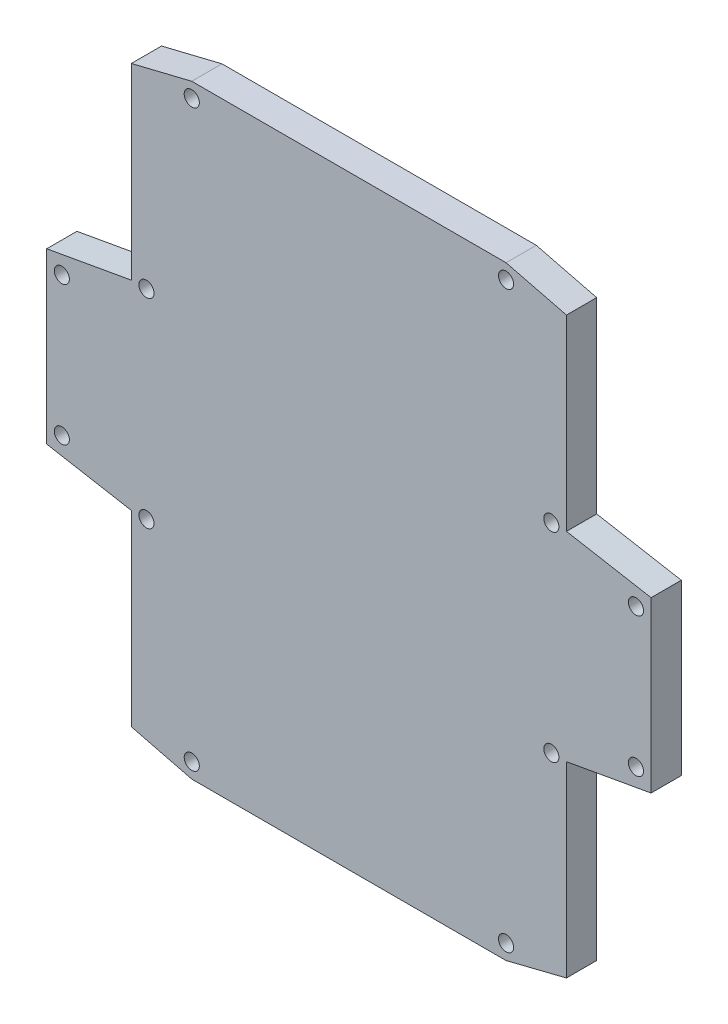
ISO-10303-21;
HEADER;
FILE_DESCRIPTION(('STEP AP214'),'2;1');
FILE_NAME('part.step','',(''),(''),'','','');
FILE_SCHEMA(('AUTOMOTIVE_DESIGN { 1 0 10303 214 1 1 1 1 }'));
ENDSEC;
DATA;
#1=APPLICATION_CONTEXT('core data for automotive mechanical design processes');
#2=APPLICATION_PROTOCOL_DEFINITION('international standard','automotive_design',2000,#1);
#3=PRODUCT_CONTEXT('',#1,'mechanical');
#4=PRODUCT('Part','Part','',(#3));
#5=PRODUCT_RELATED_PRODUCT_CATEGORY('part','',(#4));
#6=PRODUCT_DEFINITION_FORMATION('','',#4);
#7=PRODUCT_DEFINITION_CONTEXT('part definition',#1,'design');
#8=PRODUCT_DEFINITION('design','',#6,#7);
#9=PRODUCT_DEFINITION_SHAPE('','',#8);
#10=(LENGTH_UNIT() NAMED_UNIT(*) SI_UNIT(.MILLI.,.METRE.));
#11=(NAMED_UNIT(*) PLANE_ANGLE_UNIT() SI_UNIT($,.RADIAN.));
#12=(NAMED_UNIT(*) SI_UNIT($,.STERADIAN.) SOLID_ANGLE_UNIT());
#13=UNCERTAINTY_MEASURE_WITH_UNIT(LENGTH_MEASURE(1.E-05),#10,'distance_accuracy_value','');
#14=(GEOMETRIC_REPRESENTATION_CONTEXT(3) GLOBAL_UNCERTAINTY_ASSIGNED_CONTEXT((#13)) GLOBAL_UNIT_ASSIGNED_CONTEXT((#10,
#11,#12)) REPRESENTATION_CONTEXT('',''));
#15=CARTESIAN_POINT('',(0.,0.,0.));
#16=DIRECTION('',(0.,0.,1.));
#17=DIRECTION('',(1.,0.,0.));
#18=AXIS2_PLACEMENT_3D('',#15,#16,#17);
#19=CARTESIAN_POINT('',(-72.,95.1074015625573,15.));
#20=DIRECTION('',(0.237623093307681,-0.971357434483769,0.));
#21=DIRECTION('',(0.971357434483769,0.237623093307681,0.));
#22=AXIS2_PLACEMENT_3D('',#19,#20,#21);
#23=PLANE('',#22);
#24=DIRECTION('',(-0.971357434483769,-0.237623093307681,0.));
#25=VECTOR('',#24,1.);
#26=CARTESIAN_POINT('',(-52.,100.,10.));
#27=LINE('',#26,#25);
#28=CARTESIAN_POINT('',(-52.,100.,10.));
#29=VERTEX_POINT('',#28);
#30=CARTESIAN_POINT('',(-72.,95.1074015625573,10.));
#31=VERTEX_POINT('',#30);
#32=EDGE_CURVE('E145',#29,#31,#27,.T.);
#33=ORIENTED_EDGE('',*,*,#32,.F.);
#34=DIRECTION('',(0.,0.,-1.));
#35=VECTOR('',#34,1.);
#36=CARTESIAN_POINT('',(-52.,100.,15.));
#37=LINE('',#36,#35);
#38=CARTESIAN_POINT('',(-52.,100.,0.));
#39=VERTEX_POINT('',#38);
#40=EDGE_CURVE('E57',#29,#39,#37,.T.);
#41=ORIENTED_EDGE('',*,*,#40,.T.);
#42=DIRECTION('',(-0.971357434483769,-0.237623093307681,0.));
#43=VECTOR('',#42,1.);
#44=CARTESIAN_POINT('',(-72.,95.1074015625573,0.));
#45=LINE('',#44,#43);
#46=CARTESIAN_POINT('',(-72.,95.1074015625573,0.));
#47=VERTEX_POINT('',#46);
#48=EDGE_CURVE('E162',#39,#47,#45,.T.);
#49=ORIENTED_EDGE('',*,*,#48,.T.);
#50=DIRECTION('',(0.,0.,-1.));
#51=VECTOR('',#50,1.);
#52=CARTESIAN_POINT('',(-72.,95.1074015625573,15.));
#53=LINE('',#52,#51);
#54=EDGE_CURVE('E11',#31,#47,#53,.T.);
#55=ORIENTED_EDGE('',*,*,#54,.F.);
#56=EDGE_LOOP('',(#33,#41,#49,#55));
#57=FACE_BOUND('',#56,.T.);
#58=ADVANCED_FACE('F35',(#57),#23,.F.);
#59=CARTESIAN_POINT('',(-72.,33.,15.));
#60=DIRECTION('',(1.,0.,0.));
#61=DIRECTION('',(0.,0.,-1.));
#62=AXIS2_PLACEMENT_3D('',#59,#60,#61);
#63=PLANE('',#62);
#64=DIRECTION('',(0.,-1.,0.));
#65=VECTOR('',#64,1.);
#66=CARTESIAN_POINT('',(-72.,95.1074015625573,10.));
#67=LINE('',#66,#65);
#68=CARTESIAN_POINT('',(-72.,33.,10.));
#69=VERTEX_POINT('',#68);
#70=EDGE_CURVE('E148',#31,#69,#67,.T.);
#71=ORIENTED_EDGE('',*,*,#70,.F.);
#72=ORIENTED_EDGE('',*,*,#54,.T.);
#73=DIRECTION('',(0.,-1.,0.));
#74=VECTOR('',#73,1.);
#75=CARTESIAN_POINT('',(-72.,33.,0.));
#76=LINE('',#75,#74);
#77=CARTESIAN_POINT('',(-72.,33.,0.));
#78=VERTEX_POINT('',#77);
#79=EDGE_CURVE('E165',#47,#78,#76,.T.);
#80=ORIENTED_EDGE('',*,*,#79,.T.);
#81=DIRECTION('',(0.,0.,-1.));
#82=VECTOR('',#81,1.);
#83=CARTESIAN_POINT('',(-72.,33.,15.));
#84=LINE('',#83,#82);
#85=EDGE_CURVE('E42',#69,#78,#84,.T.);
#86=ORIENTED_EDGE('',*,*,#85,.F.);
#87=EDGE_LOOP('',(#71,#72,#80,#86));
#88=FACE_BOUND('',#87,.T.);
#89=ADVANCED_FACE('F156',(#88),#63,.F.);
#90=CARTESIAN_POINT('',(-72.,33.,15.));
#91=DIRECTION('',(0.175790638483657,-0.984427575508482,0.));
#92=DIRECTION('',(0.984427575508482,0.175790638483657,0.));
#93=AXIS2_PLACEMENT_3D('',#90,#91,#92);
#94=PLANE('',#93);
#95=DIRECTION('',(-0.984427575508482,-0.175790638483657,0.));
#96=VECTOR('',#95,1.);
#97=CARTESIAN_POINT('',(-72.,33.,10.));
#98=LINE('',#97,#96);
#99=CARTESIAN_POINT('',(-100.,28.,10.));
#100=VERTEX_POINT('',#99);
#101=EDGE_CURVE('E159',#69,#100,#98,.T.);
#102=ORIENTED_EDGE('',*,*,#101,.F.);
#103=ORIENTED_EDGE('',*,*,#85,.T.);
#104=DIRECTION('',(-0.984427575508482,-0.175790638483657,0.));
#105=VECTOR('',#104,1.);
#106=CARTESIAN_POINT('',(-72.,33.,0.));
#107=LINE('',#106,#105);
#108=CARTESIAN_POINT('',(-100.,28.,0.));
#109=VERTEX_POINT('',#108);
#110=EDGE_CURVE('E167',#78,#109,#107,.T.);
#111=ORIENTED_EDGE('',*,*,#110,.T.);
#112=DIRECTION('',(0.,0.,-1.));
#113=VECTOR('',#112,1.);
#114=CARTESIAN_POINT('',(-100.,28.,15.));
#115=LINE('',#114,#113);
#116=EDGE_CURVE('E237',#100,#109,#115,.T.);
#117=ORIENTED_EDGE('',*,*,#116,.F.);
#118=EDGE_LOOP('',(#102,#103,#111,#117));
#119=FACE_BOUND('',#118,.T.);
#120=ADVANCED_FACE('F239',(#119),#94,.F.);
#121=CARTESIAN_POINT('',(-100.,28.,15.));
#122=DIRECTION('',(1.,0.,0.));
#123=DIRECTION('',(0.,1.,0.));
#124=AXIS2_PLACEMENT_3D('',#121,#122,#123);
#125=PLANE('',#124);
#126=DIRECTION('',(0.,-1.,0.));
#127=VECTOR('',#126,1.);
#128=CARTESIAN_POINT('',(-100.,28.,10.));
#129=LINE('',#128,#127);
#130=CARTESIAN_POINT('',(-100.,-28.,10.));
#131=VERTEX_POINT('',#130);
#132=EDGE_CURVE('E250',#100,#131,#129,.T.);
#133=ORIENTED_EDGE('',*,*,#132,.F.);
#134=ORIENTED_EDGE('',*,*,#116,.T.);
#135=DIRECTION('',(0.,-1.,0.));
#136=VECTOR('',#135,1.);
#137=CARTESIAN_POINT('',(-100.,28.,0.));
#138=LINE('',#137,#136);
#139=CARTESIAN_POINT('',(-100.,-28.,0.));
#140=VERTEX_POINT('',#139);
#141=EDGE_CURVE('E174',#109,#140,#138,.T.);
#142=ORIENTED_EDGE('',*,*,#141,.T.);
#143=DIRECTION('',(0.,0.,-1.));
#144=VECTOR('',#143,1.);
#145=CARTESIAN_POINT('',(-100.,-28.,15.));
#146=LINE('',#145,#144);
#147=EDGE_CURVE('E235',#131,#140,#146,.T.);
#148=ORIENTED_EDGE('',*,*,#147,.F.);
#149=EDGE_LOOP('',(#133,#134,#142,#148));
#150=FACE_BOUND('',#149,.T.);
#151=ADVANCED_FACE('F249',(#150),#125,.F.);
#152=CARTESIAN_POINT('',(-72.,-33.,15.));
#153=DIRECTION('',(0.175790638483657,0.984427575508482,0.));
#154=DIRECTION('',(-0.984427575508482,0.175790638483657,0.));
#155=AXIS2_PLACEMENT_3D('',#152,#153,#154);
#156=PLANE('',#155);
#157=DIRECTION('',(0.984427575508482,-0.175790638483657,0.));
#158=VECTOR('',#157,1.);
#159=CARTESIAN_POINT('',(-100.,-28.,10.));
#160=LINE('',#159,#158);
#161=CARTESIAN_POINT('',(-72.,-33.,10.));
#162=VERTEX_POINT('',#161);
#163=EDGE_CURVE('E252',#131,#162,#160,.T.);
#164=ORIENTED_EDGE('',*,*,#163,.F.);
#165=ORIENTED_EDGE('',*,*,#147,.T.);
#166=DIRECTION('',(0.984427575508482,-0.175790638483657,0.));
#167=VECTOR('',#166,1.);
#168=CARTESIAN_POINT('',(-72.,-33.,0.));
#169=LINE('',#168,#167);
#170=CARTESIAN_POINT('',(-72.,-33.,0.));
#171=VERTEX_POINT('',#170);
#172=EDGE_CURVE('E177',#140,#171,#169,.T.);
#173=ORIENTED_EDGE('',*,*,#172,.T.);
#174=DIRECTION('',(0.,0.,-1.));
#175=VECTOR('',#174,1.);
#176=CARTESIAN_POINT('',(-72.,-33.,15.));
#177=LINE('',#176,#175);
#178=EDGE_CURVE('E233',#162,#171,#177,.T.);
#179=ORIENTED_EDGE('',*,*,#178,.F.);
#180=EDGE_LOOP('',(#164,#165,#173,#179));
#181=FACE_BOUND('',#180,.T.);
#182=ADVANCED_FACE('F309',(#181),#156,.F.);
#183=CARTESIAN_POINT('',(-72.,-33.,15.));
#184=DIRECTION('',(1.,0.,0.));
#185=DIRECTION('',(0.,1.,0.));
#186=AXIS2_PLACEMENT_3D('',#183,#184,#185);
#187=PLANE('',#186);
#188=DIRECTION('',(0.,-1.,0.));
#189=VECTOR('',#188,1.);
#190=CARTESIAN_POINT('',(-72.,-33.,10.));
#191=LINE('',#190,#189);
#192=CARTESIAN_POINT('',(-72.,-95.,10.));
#193=VERTEX_POINT('',#192);
#194=EDGE_CURVE('E254',#162,#193,#191,.T.);
#195=ORIENTED_EDGE('',*,*,#194,.F.);
#196=ORIENTED_EDGE('',*,*,#178,.T.);
#197=DIRECTION('',(0.,-1.,0.));
#198=VECTOR('',#197,1.);
#199=CARTESIAN_POINT('',(-72.,-33.,0.));
#200=LINE('',#199,#198);
#201=CARTESIAN_POINT('',(-72.,-95.,0.));
#202=VERTEX_POINT('',#201);
#203=EDGE_CURVE('E180',#171,#202,#200,.T.);
#204=ORIENTED_EDGE('',*,*,#203,.T.);
#205=DIRECTION('',(0.,0.,-1.));
#206=VECTOR('',#205,1.);
#207=CARTESIAN_POINT('',(-72.,-95.,15.));
#208=LINE('',#207,#206);
#209=EDGE_CURVE('E231',#193,#202,#208,.T.);
#210=ORIENTED_EDGE('',*,*,#209,.F.);
#211=EDGE_LOOP('',(#195,#196,#204,#210));
#212=FACE_BOUND('',#211,.T.);
#213=ADVANCED_FACE('F312',(#212),#187,.F.);
#214=CARTESIAN_POINT('',(-72.,-95.,15.));
#215=DIRECTION('',(0.242535625036333,0.970142500145332,0.));
#216=DIRECTION('',(-0.970142500145332,0.242535625036333,0.));
#217=AXIS2_PLACEMENT_3D('',#214,#215,#216);
#218=PLANE('',#217);
#219=DIRECTION('',(0.970142500145332,-0.242535625036333,0.));
#220=VECTOR('',#219,1.);
#221=CARTESIAN_POINT('',(-72.,-95.,10.));
#222=LINE('',#221,#220);
#223=CARTESIAN_POINT('',(-52.,-100.,10.));
#224=VERTEX_POINT('',#223);
#225=EDGE_CURVE('E259',#193,#224,#222,.T.);
#226=ORIENTED_EDGE('',*,*,#225,.F.);
#227=ORIENTED_EDGE('',*,*,#209,.T.);
#228=DIRECTION('',(0.970142500145332,-0.242535625036333,0.));
#229=VECTOR('',#228,1.);
#230=CARTESIAN_POINT('',(-72.,-95.,0.));
#231=LINE('',#230,#229);
#232=CARTESIAN_POINT('',(-52.,-100.,0.));
#233=VERTEX_POINT('',#232);
#234=EDGE_CURVE('E183',#202,#233,#231,.T.);
#235=ORIENTED_EDGE('',*,*,#234,.T.);
#236=DIRECTION('',(0.,0.,-1.));
#237=VECTOR('',#236,1.);
#238=CARTESIAN_POINT('',(-52.,-100.,15.));
#239=LINE('',#238,#237);
#240=EDGE_CURVE('E229',#224,#233,#239,.T.);
#241=ORIENTED_EDGE('',*,*,#240,.F.);
#242=EDGE_LOOP('',(#226,#227,#235,#241));
#243=FACE_BOUND('',#242,.T.);
#244=ADVANCED_FACE('F316',(#243),#218,.F.);
#245=CARTESIAN_POINT('',(-52.,-100.,15.));
#246=DIRECTION('',(0.,1.,0.));
#247=DIRECTION('',(-1.,0.,0.));
#248=AXIS2_PLACEMENT_3D('',#245,#246,#247);
#249=PLANE('',#248);
#250=DIRECTION('',(1.,0.,0.));
#251=VECTOR('',#250,1.);
#252=CARTESIAN_POINT('',(-52.,-100.,10.));
#253=LINE('',#252,#251);
#254=CARTESIAN_POINT('',(52.,-100.,10.));
#255=VERTEX_POINT('',#254);
#256=EDGE_CURVE('E261',#224,#255,#253,.T.);
#257=ORIENTED_EDGE('',*,*,#256,.F.);
#258=ORIENTED_EDGE('',*,*,#240,.T.);
#259=DIRECTION('',(1.,0.,0.));
#260=VECTOR('',#259,1.);
#261=CARTESIAN_POINT('',(-52.,-100.,0.));
#262=LINE('',#261,#260);
#263=CARTESIAN_POINT('',(52.,-100.,0.));
#264=VERTEX_POINT('',#263);
#265=EDGE_CURVE('E186',#233,#264,#262,.T.);
#266=ORIENTED_EDGE('',*,*,#265,.T.);
#267=DIRECTION('',(0.,0.,-1.));
#268=VECTOR('',#267,1.);
#269=CARTESIAN_POINT('',(52.,-100.,15.));
#270=LINE('',#269,#268);
#271=EDGE_CURVE('E227',#255,#264,#270,.T.);
#272=ORIENTED_EDGE('',*,*,#271,.F.);
#273=EDGE_LOOP('',(#257,#258,#266,#272));
#274=FACE_BOUND('',#273,.T.);
#275=ADVANCED_FACE('F320',(#274),#249,.F.);
#276=CARTESIAN_POINT('',(52.,-100.,15.));
#277=DIRECTION('',(-0.242535625036334,0.970142500145332,0.));
#278=DIRECTION('',(-0.970142500145332,-0.242535625036334,0.));
#279=AXIS2_PLACEMENT_3D('',#276,#277,#278);
#280=PLANE('',#279);
#281=DIRECTION('',(0.970142500145332,0.242535625036334,0.));
#282=VECTOR('',#281,1.);
#283=CARTESIAN_POINT('',(52.,-100.,10.));
#284=LINE('',#283,#282);
#285=CARTESIAN_POINT('',(72.,-95.,10.));
#286=VERTEX_POINT('',#285);
#287=EDGE_CURVE('E263',#255,#286,#284,.T.);
#288=ORIENTED_EDGE('',*,*,#287,.F.);
#289=ORIENTED_EDGE('',*,*,#271,.T.);
#290=DIRECTION('',(0.970142500145332,0.242535625036334,0.));
#291=VECTOR('',#290,1.);
#292=CARTESIAN_POINT('',(52.,-100.,0.));
#293=LINE('',#292,#291);
#294=CARTESIAN_POINT('',(72.,-95.,0.));
#295=VERTEX_POINT('',#294);
#296=EDGE_CURVE('E189',#264,#295,#293,.T.);
#297=ORIENTED_EDGE('',*,*,#296,.T.);
#298=DIRECTION('',(0.,0.,-1.));
#299=VECTOR('',#298,1.);
#300=CARTESIAN_POINT('',(72.,-95.,15.));
#301=LINE('',#300,#299);
#302=EDGE_CURVE('E225',#286,#295,#301,.T.);
#303=ORIENTED_EDGE('',*,*,#302,.F.);
#304=EDGE_LOOP('',(#288,#289,#297,#303));
#305=FACE_BOUND('',#304,.T.);
#306=ADVANCED_FACE('F324',(#305),#280,.F.);
#307=CARTESIAN_POINT('',(72.,-33.,15.));
#308=DIRECTION('',(-1.,0.,0.));
#309=DIRECTION('',(0.,-1.,0.));
#310=AXIS2_PLACEMENT_3D('',#307,#308,#309);
#311=PLANE('',#310);
#312=DIRECTION('',(0.,1.,0.));
#313=VECTOR('',#312,1.);
#314=CARTESIAN_POINT('',(72.,-95.,10.));
#315=LINE('',#314,#313);
#316=CARTESIAN_POINT('',(72.,-33.,10.));
#317=VERTEX_POINT('',#316);
#318=EDGE_CURVE('E265',#286,#317,#315,.T.);
#319=ORIENTED_EDGE('',*,*,#318,.F.);
#320=ORIENTED_EDGE('',*,*,#302,.T.);
#321=DIRECTION('',(0.,1.,0.));
#322=VECTOR('',#321,1.);
#323=CARTESIAN_POINT('',(72.,-33.,0.));
#324=LINE('',#323,#322);
#325=CARTESIAN_POINT('',(72.,-33.,0.));
#326=VERTEX_POINT('',#325);
#327=EDGE_CURVE('E192',#295,#326,#324,.T.);
#328=ORIENTED_EDGE('',*,*,#327,.T.);
#329=DIRECTION('',(0.,0.,-1.));
#330=VECTOR('',#329,1.);
#331=CARTESIAN_POINT('',(72.,-33.,15.));
#332=LINE('',#331,#330);
#333=EDGE_CURVE('E223',#317,#326,#332,.T.);
#334=ORIENTED_EDGE('',*,*,#333,.F.);
#335=EDGE_LOOP('',(#319,#320,#328,#334));
#336=FACE_BOUND('',#335,.T.);
#337=ADVANCED_FACE('F328',(#336),#311,.F.);
#338=CARTESIAN_POINT('',(72.,-33.,15.));
#339=DIRECTION('',(-0.175790638483658,0.984427575508482,0.));
#340=DIRECTION('',(-0.984427575508482,-0.175790638483658,0.));
#341=AXIS2_PLACEMENT_3D('',#338,#339,#340);
#342=PLANE('',#341);
#343=DIRECTION('',(0.984427575508482,0.175790638483658,0.));
#344=VECTOR('',#343,1.);
#345=CARTESIAN_POINT('',(72.,-33.,10.));
#346=LINE('',#345,#344);
#347=CARTESIAN_POINT('',(100.,-28.,10.));
#348=VERTEX_POINT('',#347);
#349=EDGE_CURVE('E267',#317,#348,#346,.T.);
#350=ORIENTED_EDGE('',*,*,#349,.F.);
#351=ORIENTED_EDGE('',*,*,#333,.T.);
#352=DIRECTION('',(0.984427575508482,0.175790638483658,0.));
#353=VECTOR('',#352,1.);
#354=CARTESIAN_POINT('',(72.,-33.,0.));
#355=LINE('',#354,#353);
#356=CARTESIAN_POINT('',(100.,-28.,0.));
#357=VERTEX_POINT('',#356);
#358=EDGE_CURVE('E195',#326,#357,#355,.T.);
#359=ORIENTED_EDGE('',*,*,#358,.T.);
#360=DIRECTION('',(0.,0.,-1.));
#361=VECTOR('',#360,1.);
#362=CARTESIAN_POINT('',(100.,-28.,15.));
#363=LINE('',#362,#361);
#364=EDGE_CURVE('E221',#348,#357,#363,.T.);
#365=ORIENTED_EDGE('',*,*,#364,.F.);
#366=EDGE_LOOP('',(#350,#351,#359,#365));
#367=FACE_BOUND('',#366,.T.);
#368=ADVANCED_FACE('F332',(#367),#342,.F.);
#369=CARTESIAN_POINT('',(100.,28.,15.));
#370=DIRECTION('',(-1.,0.,0.));
#371=DIRECTION('',(0.,-1.,0.));
#372=AXIS2_PLACEMENT_3D('',#369,#370,#371);
#373=PLANE('',#372);
#374=DIRECTION('',(0.,1.,0.));
#375=VECTOR('',#374,1.);
#376=CARTESIAN_POINT('',(100.,-28.,10.));
#377=LINE('',#376,#375);
#378=CARTESIAN_POINT('',(100.,28.,10.));
#379=VERTEX_POINT('',#378);
#380=EDGE_CURVE('E269',#348,#379,#377,.T.);
#381=ORIENTED_EDGE('',*,*,#380,.F.);
#382=ORIENTED_EDGE('',*,*,#364,.T.);
#383=DIRECTION('',(0.,1.,0.));
#384=VECTOR('',#383,1.);
#385=CARTESIAN_POINT('',(100.,28.,0.));
#386=LINE('',#385,#384);
#387=CARTESIAN_POINT('',(100.,28.,0.));
#388=VERTEX_POINT('',#387);
#389=EDGE_CURVE('E198',#357,#388,#386,.T.);
#390=ORIENTED_EDGE('',*,*,#389,.T.);
#391=DIRECTION('',(0.,0.,-1.));
#392=VECTOR('',#391,1.);
#393=CARTESIAN_POINT('',(100.,28.,15.));
#394=LINE('',#393,#392);
#395=EDGE_CURVE('E219',#379,#388,#394,.T.);
#396=ORIENTED_EDGE('',*,*,#395,.F.);
#397=EDGE_LOOP('',(#381,#382,#390,#396));
#398=FACE_BOUND('',#397,.T.);
#399=ADVANCED_FACE('F336',(#398),#373,.F.);
#400=CARTESIAN_POINT('',(72.,33.,15.));
#401=DIRECTION('',(-0.175790638483657,-0.984427575508482,0.));
#402=DIRECTION('',(0.984427575508482,-0.175790638483657,0.));
#403=AXIS2_PLACEMENT_3D('',#400,#401,#402);
#404=PLANE('',#403);
#405=DIRECTION('',(-0.984427575508482,0.175790638483657,0.));
#406=VECTOR('',#405,1.);
#407=CARTESIAN_POINT('',(100.,28.,10.));
#408=LINE('',#407,#406);
#409=CARTESIAN_POINT('',(72.,33.,10.));
#410=VERTEX_POINT('',#409);
#411=EDGE_CURVE('E271',#379,#410,#408,.T.);
#412=ORIENTED_EDGE('',*,*,#411,.F.);
#413=ORIENTED_EDGE('',*,*,#395,.T.);
#414=DIRECTION('',(-0.984427575508482,0.175790638483657,0.));
#415=VECTOR('',#414,1.);
#416=CARTESIAN_POINT('',(72.,33.,0.));
#417=LINE('',#416,#415);
#418=CARTESIAN_POINT('',(72.,33.,0.));
#419=VERTEX_POINT('',#418);
#420=EDGE_CURVE('E201',#388,#419,#417,.T.);
#421=ORIENTED_EDGE('',*,*,#420,.T.);
#422=DIRECTION('',(0.,0.,-1.));
#423=VECTOR('',#422,1.);
#424=CARTESIAN_POINT('',(72.,33.,15.));
#425=LINE('',#424,#423);
#426=EDGE_CURVE('E217',#410,#419,#425,.T.);
#427=ORIENTED_EDGE('',*,*,#426,.F.);
#428=EDGE_LOOP('',(#412,#413,#421,#427));
#429=FACE_BOUND('',#428,.T.);
#430=ADVANCED_FACE('F340',(#429),#404,.F.);
#431=CARTESIAN_POINT('',(72.,95.,15.));
#432=DIRECTION('',(-1.,0.,0.));
#433=DIRECTION('',(0.,-1.,0.));
#434=AXIS2_PLACEMENT_3D('',#431,#432,#433);
#435=PLANE('',#434);
#436=DIRECTION('',(0.,1.,0.));
#437=VECTOR('',#436,1.);
#438=CARTESIAN_POINT('',(72.,33.,10.));
#439=LINE('',#438,#437);
#440=CARTESIAN_POINT('',(72.,95.,10.));
#441=VERTEX_POINT('',#440);
#442=EDGE_CURVE('E273',#410,#441,#439,.T.);
#443=ORIENTED_EDGE('',*,*,#442,.F.);
#444=ORIENTED_EDGE('',*,*,#426,.T.);
#445=DIRECTION('',(0.,1.,0.));
#446=VECTOR('',#445,1.);
#447=CARTESIAN_POINT('',(72.,95.,0.));
#448=LINE('',#447,#446);
#449=CARTESIAN_POINT('',(72.,95.,0.));
#450=VERTEX_POINT('',#449);
#451=EDGE_CURVE('E204',#419,#450,#448,.T.);
#452=ORIENTED_EDGE('',*,*,#451,.T.);
#453=DIRECTION('',(0.,0.,-1.));
#454=VECTOR('',#453,1.);
#455=CARTESIAN_POINT('',(72.,95.,15.));
#456=LINE('',#455,#454);
#457=EDGE_CURVE('E215',#441,#450,#456,.T.);
#458=ORIENTED_EDGE('',*,*,#457,.F.);
#459=EDGE_LOOP('',(#443,#444,#452,#458));
#460=FACE_BOUND('',#459,.T.);
#461=ADVANCED_FACE('F282',(#460),#435,.F.);
#462=CARTESIAN_POINT('',(72.,95.,15.));
#463=DIRECTION('',(-0.242535625036332,-0.970142500145332,0.));
#464=DIRECTION('',(0.970142500145332,-0.242535625036332,0.));
#465=AXIS2_PLACEMENT_3D('',#462,#463,#464);
#466=PLANE('',#465);
#467=DIRECTION('',(-0.970142500145332,0.242535625036332,0.));
#468=VECTOR('',#467,1.);
#469=CARTESIAN_POINT('',(72.,95.,10.));
#470=LINE('',#469,#468);
#471=CARTESIAN_POINT('',(52.,100.,10.));
#472=VERTEX_POINT('',#471);
#473=EDGE_CURVE('E49',#441,#472,#470,.T.);
#474=ORIENTED_EDGE('',*,*,#473,.F.);
#475=ORIENTED_EDGE('',*,*,#457,.T.);
#476=DIRECTION('',(-0.970142500145332,0.242535625036332,0.));
#477=VECTOR('',#476,1.);
#478=CARTESIAN_POINT('',(72.,95.,0.));
#479=LINE('',#478,#477);
#480=CARTESIAN_POINT('',(52.,100.,0.));
#481=VERTEX_POINT('',#480);
#482=EDGE_CURVE('E207',#450,#481,#479,.T.);
#483=ORIENTED_EDGE('',*,*,#482,.T.);
#484=DIRECTION('',(0.,0.,-1.));
#485=VECTOR('',#484,1.);
#486=CARTESIAN_POINT('',(52.,100.,15.));
#487=LINE('',#486,#485);
#488=EDGE_CURVE('E213',#472,#481,#487,.T.);
#489=ORIENTED_EDGE('',*,*,#488,.F.);
#490=EDGE_LOOP('',(#474,#475,#483,#489));
#491=FACE_BOUND('',#490,.T.);
#492=ADVANCED_FACE('F281',(#491),#466,.F.);
#493=CARTESIAN_POINT('',(-52.,100.,15.));
#494=DIRECTION('',(0.,-1.,0.));
#495=DIRECTION('',(0.,0.,-1.));
#496=AXIS2_PLACEMENT_3D('',#493,#494,#495);
#497=PLANE('',#496);
#498=DIRECTION('',(-1.,0.,0.));
#499=VECTOR('',#498,1.);
#500=CARTESIAN_POINT('',(52.,100.,10.));
#501=LINE('',#500,#499);
#502=EDGE_CURVE('E150',#472,#29,#501,.T.);
#503=ORIENTED_EDGE('',*,*,#502,.F.);
#504=ORIENTED_EDGE('',*,*,#488,.T.);
#505=DIRECTION('',(-1.,0.,0.));
#506=VECTOR('',#505,1.);
#507=CARTESIAN_POINT('',(-52.,100.,0.));
#508=LINE('',#507,#506);
#509=EDGE_CURVE('E210',#481,#39,#508,.T.);
#510=ORIENTED_EDGE('',*,*,#509,.T.);
#511=ORIENTED_EDGE('',*,*,#40,.F.);
#512=EDGE_LOOP('',(#503,#504,#510,#511));
#513=FACE_BOUND('',#512,.T.);
#514=ADVANCED_FACE('F287',(#513),#497,.F.);
#515=CARTESIAN_POINT('',(0.,0.,0.));
#516=DIRECTION('',(0.,0.,-1.));
#517=DIRECTION('',(-1.,0.,0.));
#518=AXIS2_PLACEMENT_3D('',#515,#516,#517);
#519=PLANE('',#518);
#520=ORIENTED_EDGE('',*,*,#48,.F.);
#521=ORIENTED_EDGE('',*,*,#509,.F.);
#522=ORIENTED_EDGE('',*,*,#482,.F.);
#523=ORIENTED_EDGE('',*,*,#451,.F.);
#524=ORIENTED_EDGE('',*,*,#420,.F.);
#525=ORIENTED_EDGE('',*,*,#389,.F.);
#526=ORIENTED_EDGE('',*,*,#358,.F.);
#527=ORIENTED_EDGE('',*,*,#327,.F.);
#528=ORIENTED_EDGE('',*,*,#296,.F.);
#529=ORIENTED_EDGE('',*,*,#265,.F.);
#530=ORIENTED_EDGE('',*,*,#234,.F.);
#531=ORIENTED_EDGE('',*,*,#203,.F.);
#532=ORIENTED_EDGE('',*,*,#172,.F.);
#533=ORIENTED_EDGE('',*,*,#141,.F.);
#534=ORIENTED_EDGE('',*,*,#110,.F.);
#535=ORIENTED_EDGE('',*,*,#79,.F.);
#536=EDGE_LOOP('',(#520,#521,#522,#523,#524,#525,#526,#527,#528,#529,#530,#531,#532,#533,#534,#535));
#537=FACE_BOUND('',#536,.T.);
#538=ADVANCED_FACE('F243',(#537),#519,.T.);
#539=CARTESIAN_POINT('',(0.,0.,10.));
#540=DIRECTION('',(0.,0.,1.));
#541=DIRECTION('',(1.,0.,0.));
#542=AXIS2_PLACEMENT_3D('',#539,#540,#541);
#543=PLANE('',#542);
#544=CARTESIAN_POINT('',(67.,33.,10.));
#545=DIRECTION('',(0.,0.,1.));
#546=DIRECTION('',(-1.,0.,0.));
#547=AXIS2_PLACEMENT_3D('',#544,#545,#546);
#548=CIRCLE('',#547,2.5);
#549=CARTESIAN_POINT('',(64.5,33.,10.));
#550=VERTEX_POINT('',#549);
#551=EDGE_CURVE('E683',#550,#550,#548,.T.);
#552=ORIENTED_EDGE('',*,*,#551,.F.);
#553=EDGE_LOOP('',(#552));
#554=FACE_BOUND('',#553,.T.);
#555=CARTESIAN_POINT('',(95.,23.,10.));
#556=DIRECTION('',(0.,0.,1.));
#557=DIRECTION('',(-1.,0.,0.));
#558=AXIS2_PLACEMENT_3D('',#555,#556,#557);
#559=CIRCLE('',#558,2.50000000000001);
#560=CARTESIAN_POINT('',(92.5,23.,10.));
#561=VERTEX_POINT('',#560);
#562=EDGE_CURVE('E682',#561,#561,#559,.T.);
#563=ORIENTED_EDGE('',*,*,#562,.F.);
#564=EDGE_LOOP('',(#563));
#565=FACE_BOUND('',#564,.T.);
#566=CARTESIAN_POINT('',(95.,-23.,10.));
#567=DIRECTION('',(0.,0.,1.));
#568=DIRECTION('',(-1.,0.,0.));
#569=AXIS2_PLACEMENT_3D('',#566,#567,#568);
#570=CIRCLE('',#569,2.5);
#571=CARTESIAN_POINT('',(92.5,-23.,10.));
#572=VERTEX_POINT('',#571);
#573=EDGE_CURVE('E741',#572,#572,#570,.T.);
#574=ORIENTED_EDGE('',*,*,#573,.F.);
#575=EDGE_LOOP('',(#574));
#576=FACE_BOUND('',#575,.T.);
#577=CARTESIAN_POINT('',(-95.,-23.,10.));
#578=DIRECTION('',(0.,0.,1.));
#579=DIRECTION('',(1.,0.,0.));
#580=AXIS2_PLACEMENT_3D('',#577,#578,#579);
#581=CIRCLE('',#580,2.5);
#582=CARTESIAN_POINT('',(-92.5,-23.,10.));
#583=VERTEX_POINT('',#582);
#584=EDGE_CURVE('E729',#583,#583,#581,.T.);
#585=ORIENTED_EDGE('',*,*,#584,.F.);
#586=EDGE_LOOP('',(#585));
#587=FACE_BOUND('',#586,.T.);
#588=CARTESIAN_POINT('',(-95.,23.,10.));
#589=DIRECTION('',(0.,0.,1.));
#590=DIRECTION('',(1.,0.,0.));
#591=AXIS2_PLACEMENT_3D('',#588,#589,#590);
#592=CIRCLE('',#591,2.50000000000001);
#593=CARTESIAN_POINT('',(-92.5,23.,10.));
#594=VERTEX_POINT('',#593);
#595=EDGE_CURVE('E715',#594,#594,#592,.T.);
#596=ORIENTED_EDGE('',*,*,#595,.F.);
#597=EDGE_LOOP('',(#596));
#598=FACE_BOUND('',#597,.T.);
#599=CARTESIAN_POINT('',(-67.,33.,10.));
#600=DIRECTION('',(0.,0.,1.));
#601=DIRECTION('',(1.,0.,0.));
#602=AXIS2_PLACEMENT_3D('',#599,#600,#601);
#603=CIRCLE('',#602,2.5);
#604=CARTESIAN_POINT('',(-64.5,33.,10.));
#605=VERTEX_POINT('',#604);
#606=EDGE_CURVE('E709',#605,#605,#603,.T.);
#607=ORIENTED_EDGE('',*,*,#606,.F.);
#608=EDGE_LOOP('',(#607));
#609=FACE_BOUND('',#608,.T.);
#610=CARTESIAN_POINT('',(-67.,-33.,10.));
#611=DIRECTION('',(0.,0.,1.));
#612=DIRECTION('',(1.,0.,0.));
#613=AXIS2_PLACEMENT_3D('',#610,#611,#612);
#614=CIRCLE('',#613,2.5);
#615=CARTESIAN_POINT('',(-64.5,-33.,10.));
#616=VERTEX_POINT('',#615);
#617=EDGE_CURVE('E703',#616,#616,#614,.T.);
#618=ORIENTED_EDGE('',*,*,#617,.F.);
#619=EDGE_LOOP('',(#618));
#620=FACE_BOUND('',#619,.T.);
#621=CARTESIAN_POINT('',(-52.,-95.,10.));
#622=DIRECTION('',(0.,0.,1.));
#623=DIRECTION('',(1.,0.,0.));
#624=AXIS2_PLACEMENT_3D('',#621,#622,#623);
#625=CIRCLE('',#624,2.5);
#626=CARTESIAN_POINT('',(-49.5,-95.,10.));
#627=VERTEX_POINT('',#626);
#628=EDGE_CURVE('E697',#627,#627,#625,.T.);
#629=ORIENTED_EDGE('',*,*,#628,.F.);
#630=EDGE_LOOP('',(#629));
#631=FACE_BOUND('',#630,.T.);
#632=CARTESIAN_POINT('',(67.,-33.,10.));
#633=DIRECTION('',(0.,0.,1.));
#634=DIRECTION('',(-1.,0.,0.));
#635=AXIS2_PLACEMENT_3D('',#632,#633,#634);
#636=CIRCLE('',#635,2.49999999999998);
#637=CARTESIAN_POINT('',(64.5,-33.,10.));
#638=VERTEX_POINT('',#637);
#639=EDGE_CURVE('E763',#638,#638,#636,.T.);
#640=ORIENTED_EDGE('',*,*,#639,.F.);
#641=EDGE_LOOP('',(#640));
#642=FACE_BOUND('',#641,.T.);
#643=CARTESIAN_POINT('',(52.,-95.,10.));
#644=DIRECTION('',(0.,0.,1.));
#645=DIRECTION('',(-1.,0.,0.));
#646=AXIS2_PLACEMENT_3D('',#643,#644,#645);
#647=CIRCLE('',#646,2.5);
#648=CARTESIAN_POINT('',(49.5,-95.,10.));
#649=VERTEX_POINT('',#648);
#650=EDGE_CURVE('E767',#649,#649,#647,.T.);
#651=ORIENTED_EDGE('',*,*,#650,.F.);
#652=EDGE_LOOP('',(#651));
#653=FACE_BOUND('',#652,.T.);
#654=CARTESIAN_POINT('',(52.,95.1074015625573,10.));
#655=DIRECTION('',(0.,0.,1.));
#656=DIRECTION('',(-1.,0.,0.));
#657=AXIS2_PLACEMENT_3D('',#654,#655,#656);
#658=CIRCLE('',#657,2.5);
#659=CARTESIAN_POINT('',(49.5,95.1074015625573,10.));
#660=VERTEX_POINT('',#659);
#661=EDGE_CURVE('E736',#660,#660,#658,.T.);
#662=ORIENTED_EDGE('',*,*,#661,.F.);
#663=EDGE_LOOP('',(#662));
#664=FACE_BOUND('',#663,.T.);
#665=CARTESIAN_POINT('',(-52.,95.1074015625573,10.));
#666=DIRECTION('',(0.,0.,1.));
#667=DIRECTION('',(1.,0.,0.));
#668=AXIS2_PLACEMENT_3D('',#665,#666,#667);
#669=CIRCLE('',#668,2.5);
#670=CARTESIAN_POINT('',(-49.5,95.1074015625573,10.));
#671=VERTEX_POINT('',#670);
#672=EDGE_CURVE('E696',#671,#671,#669,.T.);
#673=ORIENTED_EDGE('',*,*,#672,.F.);
#674=EDGE_LOOP('',(#673));
#675=FACE_BOUND('',#674,.T.);
#676=ORIENTED_EDGE('',*,*,#32,.T.);
#677=ORIENTED_EDGE('',*,*,#70,.T.);
#678=ORIENTED_EDGE('',*,*,#101,.T.);
#679=ORIENTED_EDGE('',*,*,#132,.T.);
#680=ORIENTED_EDGE('',*,*,#163,.T.);
#681=ORIENTED_EDGE('',*,*,#194,.T.);
#682=ORIENTED_EDGE('',*,*,#225,.T.);
#683=ORIENTED_EDGE('',*,*,#256,.T.);
#684=ORIENTED_EDGE('',*,*,#287,.T.);
#685=ORIENTED_EDGE('',*,*,#318,.T.);
#686=ORIENTED_EDGE('',*,*,#349,.T.);
#687=ORIENTED_EDGE('',*,*,#380,.T.);
#688=ORIENTED_EDGE('',*,*,#411,.T.);
#689=ORIENTED_EDGE('',*,*,#442,.T.);
#690=ORIENTED_EDGE('',*,*,#473,.T.);
#691=ORIENTED_EDGE('',*,*,#502,.T.);
#692=EDGE_LOOP('',(#676,#677,#678,#679,#680,#681,#682,#683,#684,#685,#686,#687,#688,#689,#690,#691));
#693=FACE_BOUND('',#692,.T.);
#694=ADVANCED_FACE('F147',(#554,#565,#576,#587,#598,#609,#620,#631,#642,#653,#664,#675,#693),
#543,.T.);
#695=CARTESIAN_POINT('',(-52.,95.1074015625573,4.));
#696=DIRECTION('',(0.,0.,1.));
#697=DIRECTION('',(1.,0.,0.));
#698=AXIS2_PLACEMENT_3D('',#695,#696,#697);
#699=CYLINDRICAL_SURFACE('',#698,2.5);
#700=CARTESIAN_POINT('',(-52.,95.1074015625573,4.));
#701=DIRECTION('',(0.,0.,1.));
#702=DIRECTION('',(1.,0.,0.));
#703=AXIS2_PLACEMENT_3D('',#700,#701,#702);
#704=CIRCLE('',#703,2.5);
#705=CARTESIAN_POINT('',(-49.5,95.1074015625573,4.));
#706=VERTEX_POINT('',#705);
#707=EDGE_CURVE('E152',#706,#706,#704,.T.);
#708=ORIENTED_EDGE('',*,*,#707,.F.);
#709=EDGE_LOOP('',(#708));
#710=FACE_BOUND('',#709,.T.);
#711=ORIENTED_EDGE('',*,*,#672,.T.);
#712=EDGE_LOOP('',(#711));
#713=FACE_BOUND('',#712,.T.);
#714=ADVANCED_FACE('F435',(#710,#713),#699,.F.);
#715=CARTESIAN_POINT('',(-52.,95.1074015625573,4.));
#716=DIRECTION('',(0.,0.,1.));
#717=DIRECTION('',(1.,0.,0.));
#718=AXIS2_PLACEMENT_3D('',#715,#716,#717);
#719=PLANE('',#718);
#720=ORIENTED_EDGE('',*,*,#707,.T.);
#721=EDGE_LOOP('',(#720));
#722=FACE_BOUND('',#721,.T.);
#723=ADVANCED_FACE('F445',(#722),#719,.T.);
#724=CARTESIAN_POINT('',(52.,95.1074015625573,4.));
#725=DIRECTION('',(0.,0.,1.));
#726=DIRECTION('',(1.,0.,0.));
#727=AXIS2_PLACEMENT_3D('',#724,#725,#726);
#728=CYLINDRICAL_SURFACE('',#727,2.5);
#729=CARTESIAN_POINT('',(52.,95.1074015625573,4.));
#730=DIRECTION('',(0.,0.,1.));
#731=DIRECTION('',(-1.,0.,0.));
#732=AXIS2_PLACEMENT_3D('',#729,#730,#731);
#733=CIRCLE('',#732,2.5);
#734=CARTESIAN_POINT('',(49.5,95.1074015625573,4.));
#735=VERTEX_POINT('',#734);
#736=EDGE_CURVE('E771',#735,#735,#733,.T.);
#737=ORIENTED_EDGE('',*,*,#736,.F.);
#738=EDGE_LOOP('',(#737));
#739=FACE_BOUND('',#738,.T.);
#740=ORIENTED_EDGE('',*,*,#661,.T.);
#741=EDGE_LOOP('',(#740));
#742=FACE_BOUND('',#741,.T.);
#743=ADVANCED_FACE('F452',(#739,#742),#728,.F.);
#744=CARTESIAN_POINT('',(52.,95.1074015625573,4.));
#745=DIRECTION('',(0.,0.,-1.));
#746=DIRECTION('',(-1.,0.,0.));
#747=AXIS2_PLACEMENT_3D('',#744,#745,#746);
#748=PLANE('',#747);
#749=ORIENTED_EDGE('',*,*,#736,.T.);
#750=EDGE_LOOP('',(#749));
#751=FACE_BOUND('',#750,.T.);
#752=ADVANCED_FACE('F460',(#751),#748,.F.);
#753=CARTESIAN_POINT('',(52.,-95.,4.));
#754=DIRECTION('',(0.,0.,1.));
#755=DIRECTION('',(1.,0.,0.));
#756=AXIS2_PLACEMENT_3D('',#753,#754,#755);
#757=CYLINDRICAL_SURFACE('',#756,2.5);
#758=CARTESIAN_POINT('',(52.,-95.,4.));
#759=DIRECTION('',(0.,0.,1.));
#760=DIRECTION('',(-1.,0.,0.));
#761=AXIS2_PLACEMENT_3D('',#758,#759,#760);
#762=CIRCLE('',#761,2.5);
#763=CARTESIAN_POINT('',(49.5,-95.,4.));
#764=VERTEX_POINT('',#763);
#765=EDGE_CURVE('E774',#764,#764,#762,.T.);
#766=ORIENTED_EDGE('',*,*,#765,.F.);
#767=EDGE_LOOP('',(#766));
#768=FACE_BOUND('',#767,.T.);
#769=ORIENTED_EDGE('',*,*,#650,.T.);
#770=EDGE_LOOP('',(#769));
#771=FACE_BOUND('',#770,.T.);
#772=ADVANCED_FACE('F468',(#768,#771),#757,.F.);
#773=CARTESIAN_POINT('',(52.,-95.,4.));
#774=DIRECTION('',(0.,0.,-1.));
#775=DIRECTION('',(-1.,0.,0.));
#776=AXIS2_PLACEMENT_3D('',#773,#774,#775);
#777=PLANE('',#776);
#778=ORIENTED_EDGE('',*,*,#765,.T.);
#779=EDGE_LOOP('',(#778));
#780=FACE_BOUND('',#779,.T.);
#781=ADVANCED_FACE('F476',(#780),#777,.F.);
#782=CARTESIAN_POINT('',(67.,-33.,4.));
#783=DIRECTION('',(0.,0.,1.));
#784=DIRECTION('',(1.,0.,0.));
#785=AXIS2_PLACEMENT_3D('',#782,#783,#784);
#786=CYLINDRICAL_SURFACE('',#785,2.49999999999998);
#787=CARTESIAN_POINT('',(67.,-33.,4.));
#788=DIRECTION('',(0.,0.,1.));
#789=DIRECTION('',(-1.,0.,0.));
#790=AXIS2_PLACEMENT_3D('',#787,#788,#789);
#791=CIRCLE('',#790,2.49999999999998);
#792=CARTESIAN_POINT('',(64.5,-33.,4.));
#793=VERTEX_POINT('',#792);
#794=EDGE_CURVE('E689',#793,#793,#791,.T.);
#795=ORIENTED_EDGE('',*,*,#794,.F.);
#796=EDGE_LOOP('',(#795));
#797=FACE_BOUND('',#796,.T.);
#798=ORIENTED_EDGE('',*,*,#639,.T.);
#799=EDGE_LOOP('',(#798));
#800=FACE_BOUND('',#799,.T.);
#801=ADVANCED_FACE('F484',(#797,#800),#786,.F.);
#802=CARTESIAN_POINT('',(67.,-33.,4.));
#803=DIRECTION('',(0.,0.,-1.));
#804=DIRECTION('',(-1.,0.,0.));
#805=AXIS2_PLACEMENT_3D('',#802,#803,#804);
#806=PLANE('',#805);
#807=ORIENTED_EDGE('',*,*,#794,.T.);
#808=EDGE_LOOP('',(#807));
#809=FACE_BOUND('',#808,.T.);
#810=ADVANCED_FACE('F492',(#809),#806,.F.);
#811=CARTESIAN_POINT('',(-52.,-95.,4.));
#812=DIRECTION('',(0.,0.,1.));
#813=DIRECTION('',(1.,0.,0.));
#814=AXIS2_PLACEMENT_3D('',#811,#812,#813);
#815=CYLINDRICAL_SURFACE('',#814,2.5);
#816=CARTESIAN_POINT('',(-52.,-95.,4.));
#817=DIRECTION('',(0.,0.,1.));
#818=DIRECTION('',(1.,0.,0.));
#819=AXIS2_PLACEMENT_3D('',#816,#817,#818);
#820=CIRCLE('',#819,2.5);
#821=CARTESIAN_POINT('',(-49.5,-95.,4.));
#822=VERTEX_POINT('',#821);
#823=EDGE_CURVE('E693',#822,#822,#820,.T.);
#824=ORIENTED_EDGE('',*,*,#823,.F.);
#825=EDGE_LOOP('',(#824));
#826=FACE_BOUND('',#825,.T.);
#827=ORIENTED_EDGE('',*,*,#628,.T.);
#828=EDGE_LOOP('',(#827));
#829=FACE_BOUND('',#828,.T.);
#830=ADVANCED_FACE('F500',(#826,#829),#815,.F.);
#831=CARTESIAN_POINT('',(-52.,-95.,4.));
#832=DIRECTION('',(0.,0.,1.));
#833=DIRECTION('',(1.,0.,0.));
#834=AXIS2_PLACEMENT_3D('',#831,#832,#833);
#835=PLANE('',#834);
#836=ORIENTED_EDGE('',*,*,#823,.T.);
#837=EDGE_LOOP('',(#836));
#838=FACE_BOUND('',#837,.T.);
#839=ADVANCED_FACE('F508',(#838),#835,.T.);
#840=CARTESIAN_POINT('',(-67.,-33.,4.));
#841=DIRECTION('',(0.,0.,1.));
#842=DIRECTION('',(1.,0.,0.));
#843=AXIS2_PLACEMENT_3D('',#840,#841,#842);
#844=CYLINDRICAL_SURFACE('',#843,2.5);
#845=CARTESIAN_POINT('',(-67.,-33.,4.));
#846=DIRECTION('',(0.,0.,1.));
#847=DIRECTION('',(1.,0.,0.));
#848=AXIS2_PLACEMENT_3D('',#845,#846,#847);
#849=CIRCLE('',#848,2.5);
#850=CARTESIAN_POINT('',(-64.5,-33.,4.));
#851=VERTEX_POINT('',#850);
#852=EDGE_CURVE('E700',#851,#851,#849,.T.);
#853=ORIENTED_EDGE('',*,*,#852,.F.);
#854=EDGE_LOOP('',(#853));
#855=FACE_BOUND('',#854,.T.);
#856=ORIENTED_EDGE('',*,*,#617,.T.);
#857=EDGE_LOOP('',(#856));
#858=FACE_BOUND('',#857,.T.);
#859=ADVANCED_FACE('F516',(#855,#858),#844,.F.);
#860=CARTESIAN_POINT('',(-67.,-33.,4.));
#861=DIRECTION('',(0.,0.,1.));
#862=DIRECTION('',(1.,0.,0.));
#863=AXIS2_PLACEMENT_3D('',#860,#861,#862);
#864=PLANE('',#863);
#865=ORIENTED_EDGE('',*,*,#852,.T.);
#866=EDGE_LOOP('',(#865));
#867=FACE_BOUND('',#866,.T.);
#868=ADVANCED_FACE('F524',(#867),#864,.T.);
#869=CARTESIAN_POINT('',(-67.,33.,4.));
#870=DIRECTION('',(0.,0.,1.));
#871=DIRECTION('',(1.,0.,0.));
#872=AXIS2_PLACEMENT_3D('',#869,#870,#871);
#873=CYLINDRICAL_SURFACE('',#872,2.5);
#874=CARTESIAN_POINT('',(-67.,33.,4.));
#875=DIRECTION('',(0.,0.,1.));
#876=DIRECTION('',(1.,0.,0.));
#877=AXIS2_PLACEMENT_3D('',#874,#875,#876);
#878=CIRCLE('',#877,2.5);
#879=CARTESIAN_POINT('',(-64.5,33.,4.));
#880=VERTEX_POINT('',#879);
#881=EDGE_CURVE('E706',#880,#880,#878,.T.);
#882=ORIENTED_EDGE('',*,*,#881,.F.);
#883=EDGE_LOOP('',(#882));
#884=FACE_BOUND('',#883,.T.);
#885=ORIENTED_EDGE('',*,*,#606,.T.);
#886=EDGE_LOOP('',(#885));
#887=FACE_BOUND('',#886,.T.);
#888=ADVANCED_FACE('F532',(#884,#887),#873,.F.);
#889=CARTESIAN_POINT('',(-67.,33.,4.));
#890=DIRECTION('',(0.,0.,1.));
#891=DIRECTION('',(1.,0.,0.));
#892=AXIS2_PLACEMENT_3D('',#889,#890,#891);
#893=PLANE('',#892);
#894=ORIENTED_EDGE('',*,*,#881,.T.);
#895=EDGE_LOOP('',(#894));
#896=FACE_BOUND('',#895,.T.);
#897=ADVANCED_FACE('F540',(#896),#893,.T.);
#898=CARTESIAN_POINT('',(-95.,23.,4.));
#899=DIRECTION('',(0.,0.,1.));
#900=DIRECTION('',(1.,0.,0.));
#901=AXIS2_PLACEMENT_3D('',#898,#899,#900);
#902=CYLINDRICAL_SURFACE('',#901,2.50000000000001);
#903=CARTESIAN_POINT('',(-95.,23.,4.));
#904=DIRECTION('',(0.,0.,1.));
#905=DIRECTION('',(1.,0.,0.));
#906=AXIS2_PLACEMENT_3D('',#903,#904,#905);
#907=CIRCLE('',#906,2.50000000000001);
#908=CARTESIAN_POINT('',(-92.5,23.,4.));
#909=VERTEX_POINT('',#908);
#910=EDGE_CURVE('E712',#909,#909,#907,.T.);
#911=ORIENTED_EDGE('',*,*,#910,.F.);
#912=EDGE_LOOP('',(#911));
#913=FACE_BOUND('',#912,.T.);
#914=ORIENTED_EDGE('',*,*,#595,.T.);
#915=EDGE_LOOP('',(#914));
#916=FACE_BOUND('',#915,.T.);
#917=ADVANCED_FACE('F548',(#913,#916),#902,.F.);
#918=CARTESIAN_POINT('',(-95.,23.,4.));
#919=DIRECTION('',(0.,0.,1.));
#920=DIRECTION('',(1.,0.,0.));
#921=AXIS2_PLACEMENT_3D('',#918,#919,#920);
#922=PLANE('',#921);
#923=ORIENTED_EDGE('',*,*,#910,.T.);
#924=EDGE_LOOP('',(#923));
#925=FACE_BOUND('',#924,.T.);
#926=ADVANCED_FACE('F556',(#925),#922,.T.);
#927=CARTESIAN_POINT('',(-95.,-23.,4.));
#928=DIRECTION('',(0.,0.,1.));
#929=DIRECTION('',(1.,0.,0.));
#930=AXIS2_PLACEMENT_3D('',#927,#928,#929);
#931=CYLINDRICAL_SURFACE('',#930,2.5);
#932=CARTESIAN_POINT('',(-95.,-23.,4.));
#933=DIRECTION('',(0.,0.,1.));
#934=DIRECTION('',(1.,0.,0.));
#935=AXIS2_PLACEMENT_3D('',#932,#933,#934);
#936=CIRCLE('',#935,2.5);
#937=CARTESIAN_POINT('',(-92.5,-23.,4.));
#938=VERTEX_POINT('',#937);
#939=EDGE_CURVE('E718',#938,#938,#936,.T.);
#940=ORIENTED_EDGE('',*,*,#939,.F.);
#941=EDGE_LOOP('',(#940));
#942=FACE_BOUND('',#941,.T.);
#943=ORIENTED_EDGE('',*,*,#584,.T.);
#944=EDGE_LOOP('',(#943));
#945=FACE_BOUND('',#944,.T.);
#946=ADVANCED_FACE('F564',(#942,#945),#931,.F.);
#947=CARTESIAN_POINT('',(-95.,-23.,4.));
#948=DIRECTION('',(0.,0.,1.));
#949=DIRECTION('',(1.,0.,0.));
#950=AXIS2_PLACEMENT_3D('',#947,#948,#949);
#951=PLANE('',#950);
#952=ORIENTED_EDGE('',*,*,#939,.T.);
#953=EDGE_LOOP('',(#952));
#954=FACE_BOUND('',#953,.T.);
#955=ADVANCED_FACE('F572',(#954),#951,.T.);
#956=CARTESIAN_POINT('',(95.,-23.,4.));
#957=DIRECTION('',(0.,0.,1.));
#958=DIRECTION('',(1.,0.,0.));
#959=AXIS2_PLACEMENT_3D('',#956,#957,#958);
#960=CYLINDRICAL_SURFACE('',#959,2.5);
#961=CARTESIAN_POINT('',(95.,-23.,4.));
#962=DIRECTION('',(0.,0.,1.));
#963=DIRECTION('',(-1.,0.,0.));
#964=AXIS2_PLACEMENT_3D('',#961,#962,#963);
#965=CIRCLE('',#964,2.5);
#966=CARTESIAN_POINT('',(92.5,-23.,4.));
#967=VERTEX_POINT('',#966);
#968=EDGE_CURVE('E733',#967,#967,#965,.T.);
#969=ORIENTED_EDGE('',*,*,#968,.F.);
#970=EDGE_LOOP('',(#969));
#971=FACE_BOUND('',#970,.T.);
#972=ORIENTED_EDGE('',*,*,#573,.T.);
#973=EDGE_LOOP('',(#972));
#974=FACE_BOUND('',#973,.T.);
#975=ADVANCED_FACE('F580',(#971,#974),#960,.F.);
#976=CARTESIAN_POINT('',(95.,-23.,4.));
#977=DIRECTION('',(0.,0.,-1.));
#978=DIRECTION('',(-1.,0.,0.));
#979=AXIS2_PLACEMENT_3D('',#976,#977,#978);
#980=PLANE('',#979);
#981=ORIENTED_EDGE('',*,*,#968,.T.);
#982=EDGE_LOOP('',(#981));
#983=FACE_BOUND('',#982,.T.);
#984=ADVANCED_FACE('F588',(#983),#980,.F.);
#985=CARTESIAN_POINT('',(95.,23.,4.));
#986=DIRECTION('',(0.,0.,1.));
#987=DIRECTION('',(1.,0.,0.));
#988=AXIS2_PLACEMENT_3D('',#985,#986,#987);
#989=CYLINDRICAL_SURFACE('',#988,2.50000000000001);
#990=CARTESIAN_POINT('',(95.,23.,4.));
#991=DIRECTION('',(0.,0.,1.));
#992=DIRECTION('',(-1.,0.,0.));
#993=AXIS2_PLACEMENT_3D('',#990,#991,#992);
#994=CIRCLE('',#993,2.50000000000001);
#995=CARTESIAN_POINT('',(92.5,23.,4.));
#996=VERTEX_POINT('',#995);
#997=EDGE_CURVE('E686',#996,#996,#994,.T.);
#998=ORIENTED_EDGE('',*,*,#997,.F.);
#999=EDGE_LOOP('',(#998));
#1000=FACE_BOUND('',#999,.T.);
#1001=ORIENTED_EDGE('',*,*,#562,.T.);
#1002=EDGE_LOOP('',(#1001));
#1003=FACE_BOUND('',#1002,.T.);
#1004=ADVANCED_FACE('F596',(#1000,#1003),#989,.F.);
#1005=CARTESIAN_POINT('',(95.,23.,4.));
#1006=DIRECTION('',(0.,0.,-1.));
#1007=DIRECTION('',(-1.,0.,0.));
#1008=AXIS2_PLACEMENT_3D('',#1005,#1006,#1007);
#1009=PLANE('',#1008);
#1010=ORIENTED_EDGE('',*,*,#997,.T.);
#1011=EDGE_LOOP('',(#1010));
#1012=FACE_BOUND('',#1011,.T.);
#1013=ADVANCED_FACE('F604',(#1012),#1009,.F.);
#1014=CARTESIAN_POINT('',(67.,33.,4.));
#1015=DIRECTION('',(0.,0.,1.));
#1016=DIRECTION('',(1.,0.,0.));
#1017=AXIS2_PLACEMENT_3D('',#1014,#1015,#1016);
#1018=CYLINDRICAL_SURFACE('',#1017,2.5);
#1019=CARTESIAN_POINT('',(67.,33.,4.));
#1020=DIRECTION('',(0.,0.,1.));
#1021=DIRECTION('',(-1.,0.,0.));
#1022=AXIS2_PLACEMENT_3D('',#1019,#1020,#1021);
#1023=CIRCLE('',#1022,2.5);
#1024=CARTESIAN_POINT('',(64.5,33.,4.));
#1025=VERTEX_POINT('',#1024);
#1026=EDGE_CURVE('E681',#1025,#1025,#1023,.T.);
#1027=ORIENTED_EDGE('',*,*,#1026,.F.);
#1028=EDGE_LOOP('',(#1027));
#1029=FACE_BOUND('',#1028,.T.);
#1030=ORIENTED_EDGE('',*,*,#551,.T.);
#1031=EDGE_LOOP('',(#1030));
#1032=FACE_BOUND('',#1031,.T.);
#1033=ADVANCED_FACE('F612',(#1029,#1032),#1018,.F.);
#1034=CARTESIAN_POINT('',(67.,33.,4.));
#1035=DIRECTION('',(0.,0.,-1.));
#1036=DIRECTION('',(-1.,0.,0.));
#1037=AXIS2_PLACEMENT_3D('',#1034,#1035,#1036);
#1038=PLANE('',#1037);
#1039=ORIENTED_EDGE('',*,*,#1026,.T.);
#1040=EDGE_LOOP('',(#1039));
#1041=FACE_BOUND('',#1040,.T.);
#1042=ADVANCED_FACE('F620',(#1041),#1038,.F.);
#1043=CLOSED_SHELL('',(#58,#89,#120,#151,#182,#213,#244,#275,#306,#337,#368,#399,#430,#461,#492,
#514,#538,#694,#714,#723,#743,#752,#772,#781,#801,#810,#830,#839,#859,#868,#888,#897,#917,#926,
#946,#955,#975,#984,#1004,#1013,#1033,#1042));
#1044=MANIFOLD_SOLID_BREP('B2',#1043);
#1045=ADVANCED_BREP_SHAPE_REPRESENTATION('',(#18,#1044),#14);
#1046=SHAPE_DEFINITION_REPRESENTATION(#9,#1045);
ENDSEC;
END-ISO-10303-21;
